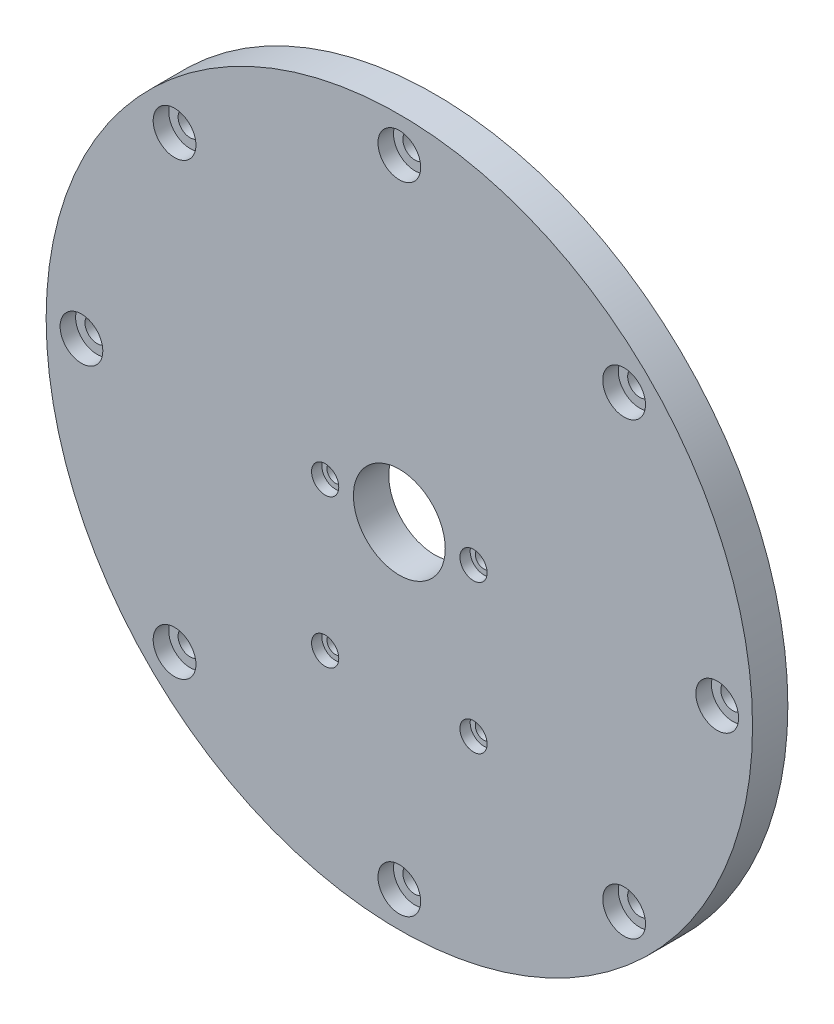
ISO-10303-21;
HEADER;
FILE_DESCRIPTION(('STEP AP214'),'2;1');
FILE_NAME('part.step','',(''),(''),'','','');
FILE_SCHEMA(('AUTOMOTIVE_DESIGN { 1 0 10303 214 1 1 1 1 }'));
ENDSEC;
DATA;
#1=APPLICATION_CONTEXT('core data for automotive mechanical design processes');
#2=APPLICATION_PROTOCOL_DEFINITION('international standard','automotive_design',2000,#1);
#3=PRODUCT_CONTEXT('',#1,'mechanical');
#4=PRODUCT('Part','Part','',(#3));
#5=PRODUCT_RELATED_PRODUCT_CATEGORY('part','',(#4));
#6=PRODUCT_DEFINITION_FORMATION('','',#4);
#7=PRODUCT_DEFINITION_CONTEXT('part definition',#1,'design');
#8=PRODUCT_DEFINITION('design','',#6,#7);
#9=PRODUCT_DEFINITION_SHAPE('','',#8);
#10=(LENGTH_UNIT() NAMED_UNIT(*) SI_UNIT(.MILLI.,.METRE.));
#11=(NAMED_UNIT(*) PLANE_ANGLE_UNIT() SI_UNIT($,.RADIAN.));
#12=(NAMED_UNIT(*) SI_UNIT($,.STERADIAN.) SOLID_ANGLE_UNIT());
#13=UNCERTAINTY_MEASURE_WITH_UNIT(LENGTH_MEASURE(1.E-05),#10,'distance_accuracy_value','');
#14=(GEOMETRIC_REPRESENTATION_CONTEXT(3) GLOBAL_UNCERTAINTY_ASSIGNED_CONTEXT((#13)) GLOBAL_UNIT_ASSIGNED_CONTEXT((#10,
#11,#12)) REPRESENTATION_CONTEXT('',''));
#15=CARTESIAN_POINT('',(0.,0.,0.));
#16=DIRECTION('',(0.,0.,1.));
#17=DIRECTION('',(1.,0.,0.));
#18=AXIS2_PLACEMENT_3D('',#15,#16,#17);
#19=CARTESIAN_POINT('',(0.,0.,5.));
#20=DIRECTION('',(0.,0.,-1.));
#21=DIRECTION('',(-1.,0.,0.));
#22=AXIS2_PLACEMENT_3D('',#19,#20,#21);
#23=CYLINDRICAL_SURFACE('',#22,50.);
#24=CARTESIAN_POINT('',(0.,0.,5.));
#25=DIRECTION('',(0.,0.,1.));
#26=DIRECTION('',(1.,0.,0.));
#27=AXIS2_PLACEMENT_3D('',#24,#25,#26);
#28=CIRCLE('',#27,50.);
#29=CARTESIAN_POINT('',(50.,0.,5.));
#30=VERTEX_POINT('',#29);
#31=EDGE_CURVE('E10',#30,#30,#28,.T.);
#32=ORIENTED_EDGE('',*,*,#31,.F.);
#33=EDGE_LOOP('',(#32));
#34=FACE_BOUND('',#33,.T.);
#35=CARTESIAN_POINT('',(0.,0.,0.));
#36=DIRECTION('',(0.,0.,1.));
#37=DIRECTION('',(1.,0.,0.));
#38=AXIS2_PLACEMENT_3D('',#35,#36,#37);
#39=CIRCLE('',#38,50.);
#40=CARTESIAN_POINT('',(50.,0.,0.));
#41=VERTEX_POINT('',#40);
#42=EDGE_CURVE('E39',#41,#41,#39,.T.);
#43=ORIENTED_EDGE('',*,*,#42,.T.);
#44=EDGE_LOOP('',(#43));
#45=FACE_BOUND('',#44,.T.);
#46=ADVANCED_FACE('F36',(#34,#45),#23,.T.);
#47=CARTESIAN_POINT('',(0.,0.,5.));
#48=DIRECTION('',(0.,0.,1.));
#49=DIRECTION('',(1.,0.,0.));
#50=AXIS2_PLACEMENT_3D('',#47,#48,#49);
#51=PLANE('',#50);
#52=CARTESIAN_POINT('',(0.,0.,5.));
#53=DIRECTION('',(0.,0.,1.));
#54=DIRECTION('',(1.,0.,0.));
#55=AXIS2_PLACEMENT_3D('',#52,#53,#54);
#56=CIRCLE('',#55,6.5);
#57=CARTESIAN_POINT('',(6.5,0.,5.));
#58=VERTEX_POINT('',#57);
#59=EDGE_CURVE('E192',#58,#58,#56,.T.);
#60=ORIENTED_EDGE('',*,*,#59,.F.);
#61=EDGE_LOOP('',(#60));
#62=FACE_BOUND('',#61,.T.);
#63=CARTESIAN_POINT('',(31.819805153395,-31.8198051533942,5.));
#64=DIRECTION('',(0.,0.,1.));
#65=DIRECTION('',(1.,0.,0.));
#66=AXIS2_PLACEMENT_3D('',#63,#64,#65);
#67=CIRCLE('',#66,3.025);
#68=CARTESIAN_POINT('',(34.844805153395,-31.8198051533942,5.));
#69=VERTEX_POINT('',#68);
#70=EDGE_CURVE('E188',#69,#69,#67,.T.);
#71=ORIENTED_EDGE('',*,*,#70,.F.);
#72=EDGE_LOOP('',(#71));
#73=FACE_BOUND('',#72,.T.);
#74=CARTESIAN_POINT('',(4.71349980743823E-13,-45.,5.));
#75=DIRECTION('',(0.,0.,1.));
#76=DIRECTION('',(1.,0.,0.));
#77=AXIS2_PLACEMENT_3D('',#74,#75,#76);
#78=CIRCLE('',#77,3.025);
#79=CARTESIAN_POINT('',(3.02500000000047,-45.,5.));
#80=VERTEX_POINT('',#79);
#81=EDGE_CURVE('E176',#80,#80,#78,.T.);
#82=ORIENTED_EDGE('',*,*,#81,.F.);
#83=EDGE_LOOP('',(#82));
#84=FACE_BOUND('',#83,.T.);
#85=CARTESIAN_POINT('',(-31.8198051533944,-31.8198051533949,5.));
#86=DIRECTION('',(0.,0.,1.));
#87=DIRECTION('',(1.,0.,0.));
#88=AXIS2_PLACEMENT_3D('',#85,#86,#87);
#89=CIRCLE('',#88,3.025);
#90=CARTESIAN_POINT('',(-28.7948051533944,-31.8198051533949,5.));
#91=VERTEX_POINT('',#90);
#92=EDGE_CURVE('E164',#91,#91,#89,.T.);
#93=ORIENTED_EDGE('',*,*,#92,.F.);
#94=EDGE_LOOP('',(#93));
#95=FACE_BOUND('',#94,.T.);
#96=CARTESIAN_POINT('',(-45.,0.,5.));
#97=DIRECTION('',(0.,0.,1.));
#98=DIRECTION('',(1.,0.,0.));
#99=AXIS2_PLACEMENT_3D('',#96,#97,#98);
#100=CIRCLE('',#99,3.025);
#101=CARTESIAN_POINT('',(-41.975,0.,5.));
#102=VERTEX_POINT('',#101);
#103=EDGE_CURVE('E152',#102,#102,#100,.T.);
#104=ORIENTED_EDGE('',*,*,#103,.F.);
#105=EDGE_LOOP('',(#104));
#106=FACE_BOUND('',#105,.T.);
#107=CARTESIAN_POINT('',(-31.8198051533948,31.8198051533945,5.));
#108=DIRECTION('',(0.,0.,1.));
#109=DIRECTION('',(1.,0.,0.));
#110=AXIS2_PLACEMENT_3D('',#107,#108,#109);
#111=CIRCLE('',#110,3.025);
#112=CARTESIAN_POINT('',(-28.7948051533948,31.8198051533945,5.));
#113=VERTEX_POINT('',#112);
#114=EDGE_CURVE('E140',#113,#113,#111,.T.);
#115=ORIENTED_EDGE('',*,*,#114,.F.);
#116=EDGE_LOOP('',(#115));
#117=FACE_BOUND('',#116,.T.);
#118=CARTESIAN_POINT('',(-1.57116660247941E-13,45.,5.));
#119=DIRECTION('',(0.,0.,1.));
#120=DIRECTION('',(1.,0.,0.));
#121=AXIS2_PLACEMENT_3D('',#118,#119,#120);
#122=CIRCLE('',#121,3.025);
#123=CARTESIAN_POINT('',(3.02499999999984,45.,5.));
#124=VERTEX_POINT('',#123);
#125=EDGE_CURVE('E128',#124,#124,#122,.T.);
#126=ORIENTED_EDGE('',*,*,#125,.F.);
#127=EDGE_LOOP('',(#126));
#128=FACE_BOUND('',#127,.T.);
#129=CARTESIAN_POINT('',(31.8198051533946,31.8198051533947,5.));
#130=DIRECTION('',(0.,0.,1.));
#131=DIRECTION('',(1.,0.,0.));
#132=AXIS2_PLACEMENT_3D('',#129,#130,#131);
#133=CIRCLE('',#132,3.025);
#134=CARTESIAN_POINT('',(34.8448051533946,31.8198051533947,5.));
#135=VERTEX_POINT('',#134);
#136=EDGE_CURVE('E116',#135,#135,#133,.T.);
#137=ORIENTED_EDGE('',*,*,#136,.F.);
#138=EDGE_LOOP('',(#137));
#139=FACE_BOUND('',#138,.T.);
#140=CARTESIAN_POINT('',(45.,0.,5.));
#141=DIRECTION('',(0.,0.,1.));
#142=DIRECTION('',(1.,0.,0.));
#143=AXIS2_PLACEMENT_3D('',#140,#141,#142);
#144=CIRCLE('',#143,3.025);
#145=CARTESIAN_POINT('',(48.025,0.,5.));
#146=VERTEX_POINT('',#145);
#147=EDGE_CURVE('E104',#146,#146,#144,.T.);
#148=ORIENTED_EDGE('',*,*,#147,.F.);
#149=EDGE_LOOP('',(#148));
#150=FACE_BOUND('',#149,.T.);
#151=CARTESIAN_POINT('',(10.5,0.,5.));
#152=DIRECTION('',(0.,0.,1.));
#153=DIRECTION('',(1.,0.,0.));
#154=AXIS2_PLACEMENT_3D('',#151,#152,#153);
#155=CIRCLE('',#154,1.925);
#156=CARTESIAN_POINT('',(12.425,0.,5.));
#157=VERTEX_POINT('',#156);
#158=EDGE_CURVE('E92',#157,#157,#155,.T.);
#159=ORIENTED_EDGE('',*,*,#158,.F.);
#160=EDGE_LOOP('',(#159));
#161=FACE_BOUND('',#160,.T.);
#162=CARTESIAN_POINT('',(10.5,-21.,5.));
#163=DIRECTION('',(0.,0.,1.));
#164=DIRECTION('',(1.,0.,0.));
#165=AXIS2_PLACEMENT_3D('',#162,#163,#164);
#166=CIRCLE('',#165,1.925);
#167=CARTESIAN_POINT('',(12.425,-21.,5.));
#168=VERTEX_POINT('',#167);
#169=EDGE_CURVE('E80',#168,#168,#166,.T.);
#170=ORIENTED_EDGE('',*,*,#169,.F.);
#171=EDGE_LOOP('',(#170));
#172=FACE_BOUND('',#171,.T.);
#173=CARTESIAN_POINT('',(-10.5,0.,5.));
#174=DIRECTION('',(0.,0.,1.));
#175=DIRECTION('',(1.,0.,0.));
#176=AXIS2_PLACEMENT_3D('',#173,#174,#175);
#177=CIRCLE('',#176,1.925);
#178=CARTESIAN_POINT('',(-8.575,0.,5.));
#179=VERTEX_POINT('',#178);
#180=EDGE_CURVE('E68',#179,#179,#177,.T.);
#181=ORIENTED_EDGE('',*,*,#180,.F.);
#182=EDGE_LOOP('',(#181));
#183=FACE_BOUND('',#182,.T.);
#184=CARTESIAN_POINT('',(-10.5,-21.,5.));
#185=DIRECTION('',(0.,0.,1.));
#186=DIRECTION('',(1.,0.,0.));
#187=AXIS2_PLACEMENT_3D('',#184,#185,#186);
#188=CIRCLE('',#187,1.925);
#189=CARTESIAN_POINT('',(-8.575,-21.,5.));
#190=VERTEX_POINT('',#189);
#191=EDGE_CURVE('E56',#190,#190,#188,.T.);
#192=ORIENTED_EDGE('',*,*,#191,.F.);
#193=EDGE_LOOP('',(#192));
#194=FACE_BOUND('',#193,.T.);
#195=ORIENTED_EDGE('',*,*,#31,.T.);
#196=EDGE_LOOP('',(#195));
#197=FACE_BOUND('',#196,.T.);
#198=ADVANCED_FACE('F208',(#62,#73,#84,#95,#106,#117,#128,#139,#150,#161,#172,#183,#194,#197),
#51,.T.);
#199=CARTESIAN_POINT('',(0.,0.,0.));
#200=DIRECTION('',(0.,0.,1.));
#201=DIRECTION('',(1.,0.,0.));
#202=AXIS2_PLACEMENT_3D('',#199,#200,#201);
#203=PLANE('',#202);
#204=CARTESIAN_POINT('',(0.,0.,0.));
#205=DIRECTION('',(0.,0.,1.));
#206=DIRECTION('',(1.,0.,0.));
#207=AXIS2_PLACEMENT_3D('',#204,#205,#206);
#208=CIRCLE('',#207,6.5);
#209=CARTESIAN_POINT('',(6.5,0.,0.));
#210=VERTEX_POINT('',#209);
#211=EDGE_CURVE('E191',#210,#210,#208,.T.);
#212=ORIENTED_EDGE('',*,*,#211,.T.);
#213=EDGE_LOOP('',(#212));
#214=FACE_BOUND('',#213,.T.);
#215=CARTESIAN_POINT('',(31.819805153395,-31.8198051533942,0.));
#216=DIRECTION('',(0.,0.,1.));
#217=DIRECTION('',(1.,0.,0.));
#218=AXIS2_PLACEMENT_3D('',#215,#216,#217);
#219=CIRCLE('',#218,1.7);
#220=CARTESIAN_POINT('',(33.519805153395,-31.8198051533942,0.));
#221=VERTEX_POINT('',#220);
#222=EDGE_CURVE('E179',#221,#221,#219,.T.);
#223=ORIENTED_EDGE('',*,*,#222,.T.);
#224=EDGE_LOOP('',(#223));
#225=FACE_BOUND('',#224,.T.);
#226=CARTESIAN_POINT('',(4.71349980743823E-13,-45.,0.));
#227=DIRECTION('',(0.,0.,1.));
#228=DIRECTION('',(1.,0.,0.));
#229=AXIS2_PLACEMENT_3D('',#226,#227,#228);
#230=CIRCLE('',#229,1.7);
#231=CARTESIAN_POINT('',(1.70000000000047,-45.,0.));
#232=VERTEX_POINT('',#231);
#233=EDGE_CURVE('E167',#232,#232,#230,.T.);
#234=ORIENTED_EDGE('',*,*,#233,.T.);
#235=EDGE_LOOP('',(#234));
#236=FACE_BOUND('',#235,.T.);
#237=CARTESIAN_POINT('',(-31.8198051533944,-31.8198051533949,0.));
#238=DIRECTION('',(0.,0.,1.));
#239=DIRECTION('',(1.,0.,0.));
#240=AXIS2_PLACEMENT_3D('',#237,#238,#239);
#241=CIRCLE('',#240,1.7);
#242=CARTESIAN_POINT('',(-30.1198051533944,-31.8198051533949,0.));
#243=VERTEX_POINT('',#242);
#244=EDGE_CURVE('E155',#243,#243,#241,.T.);
#245=ORIENTED_EDGE('',*,*,#244,.T.);
#246=EDGE_LOOP('',(#245));
#247=FACE_BOUND('',#246,.T.);
#248=CARTESIAN_POINT('',(-45.,0.,0.));
#249=DIRECTION('',(0.,0.,1.));
#250=DIRECTION('',(1.,0.,0.));
#251=AXIS2_PLACEMENT_3D('',#248,#249,#250);
#252=CIRCLE('',#251,1.7);
#253=CARTESIAN_POINT('',(-43.3,0.,0.));
#254=VERTEX_POINT('',#253);
#255=EDGE_CURVE('E143',#254,#254,#252,.T.);
#256=ORIENTED_EDGE('',*,*,#255,.T.);
#257=EDGE_LOOP('',(#256));
#258=FACE_BOUND('',#257,.T.);
#259=CARTESIAN_POINT('',(-31.8198051533948,31.8198051533945,0.));
#260=DIRECTION('',(0.,0.,1.));
#261=DIRECTION('',(1.,0.,0.));
#262=AXIS2_PLACEMENT_3D('',#259,#260,#261);
#263=CIRCLE('',#262,1.7);
#264=CARTESIAN_POINT('',(-30.1198051533948,31.8198051533945,0.));
#265=VERTEX_POINT('',#264);
#266=EDGE_CURVE('E131',#265,#265,#263,.T.);
#267=ORIENTED_EDGE('',*,*,#266,.T.);
#268=EDGE_LOOP('',(#267));
#269=FACE_BOUND('',#268,.T.);
#270=CARTESIAN_POINT('',(-1.57116660247941E-13,45.,0.));
#271=DIRECTION('',(0.,0.,1.));
#272=DIRECTION('',(1.,0.,0.));
#273=AXIS2_PLACEMENT_3D('',#270,#271,#272);
#274=CIRCLE('',#273,1.7);
#275=CARTESIAN_POINT('',(1.69999999999984,45.,0.));
#276=VERTEX_POINT('',#275);
#277=EDGE_CURVE('E119',#276,#276,#274,.T.);
#278=ORIENTED_EDGE('',*,*,#277,.T.);
#279=EDGE_LOOP('',(#278));
#280=FACE_BOUND('',#279,.T.);
#281=CARTESIAN_POINT('',(31.8198051533946,31.8198051533947,0.));
#282=DIRECTION('',(0.,0.,1.));
#283=DIRECTION('',(1.,0.,0.));
#284=AXIS2_PLACEMENT_3D('',#281,#282,#283);
#285=CIRCLE('',#284,1.7);
#286=CARTESIAN_POINT('',(33.5198051533946,31.8198051533947,0.));
#287=VERTEX_POINT('',#286);
#288=EDGE_CURVE('E107',#287,#287,#285,.T.);
#289=ORIENTED_EDGE('',*,*,#288,.T.);
#290=EDGE_LOOP('',(#289));
#291=FACE_BOUND('',#290,.T.);
#292=CARTESIAN_POINT('',(45.,0.,0.));
#293=DIRECTION('',(0.,0.,1.));
#294=DIRECTION('',(1.,0.,0.));
#295=AXIS2_PLACEMENT_3D('',#292,#293,#294);
#296=CIRCLE('',#295,1.7);
#297=CARTESIAN_POINT('',(46.7,0.,0.));
#298=VERTEX_POINT('',#297);
#299=EDGE_CURVE('E95',#298,#298,#296,.T.);
#300=ORIENTED_EDGE('',*,*,#299,.T.);
#301=EDGE_LOOP('',(#300));
#302=FACE_BOUND('',#301,.T.);
#303=CARTESIAN_POINT('',(10.5,0.,0.));
#304=DIRECTION('',(0.,0.,1.));
#305=DIRECTION('',(1.,0.,0.));
#306=AXIS2_PLACEMENT_3D('',#303,#304,#305);
#307=CIRCLE('',#306,1.2);
#308=CARTESIAN_POINT('',(11.7,0.,0.));
#309=VERTEX_POINT('',#308);
#310=EDGE_CURVE('E83',#309,#309,#307,.T.);
#311=ORIENTED_EDGE('',*,*,#310,.T.);
#312=EDGE_LOOP('',(#311));
#313=FACE_BOUND('',#312,.T.);
#314=CARTESIAN_POINT('',(10.5,-21.,0.));
#315=DIRECTION('',(0.,0.,1.));
#316=DIRECTION('',(1.,0.,0.));
#317=AXIS2_PLACEMENT_3D('',#314,#315,#316);
#318=CIRCLE('',#317,1.2);
#319=CARTESIAN_POINT('',(11.7,-21.,0.));
#320=VERTEX_POINT('',#319);
#321=EDGE_CURVE('E71',#320,#320,#318,.T.);
#322=ORIENTED_EDGE('',*,*,#321,.T.);
#323=EDGE_LOOP('',(#322));
#324=FACE_BOUND('',#323,.T.);
#325=CARTESIAN_POINT('',(-10.5,0.,0.));
#326=DIRECTION('',(0.,0.,1.));
#327=DIRECTION('',(1.,0.,0.));
#328=AXIS2_PLACEMENT_3D('',#325,#326,#327);
#329=CIRCLE('',#328,1.2);
#330=CARTESIAN_POINT('',(-9.3,0.,0.));
#331=VERTEX_POINT('',#330);
#332=EDGE_CURVE('E59',#331,#331,#329,.T.);
#333=ORIENTED_EDGE('',*,*,#332,.T.);
#334=EDGE_LOOP('',(#333));
#335=FACE_BOUND('',#334,.T.);
#336=CARTESIAN_POINT('',(-10.5,-21.,0.));
#337=DIRECTION('',(0.,0.,1.));
#338=DIRECTION('',(1.,0.,0.));
#339=AXIS2_PLACEMENT_3D('',#336,#337,#338);
#340=CIRCLE('',#339,1.2);
#341=CARTESIAN_POINT('',(-9.3,-21.,0.));
#342=VERTEX_POINT('',#341);
#343=EDGE_CURVE('E46',#342,#342,#340,.T.);
#344=ORIENTED_EDGE('',*,*,#343,.T.);
#345=EDGE_LOOP('',(#344));
#346=FACE_BOUND('',#345,.T.);
#347=ORIENTED_EDGE('',*,*,#42,.F.);
#348=EDGE_LOOP('',(#347));
#349=FACE_BOUND('',#348,.T.);
#350=ADVANCED_FACE('F198',(#214,#225,#236,#247,#258,#269,#280,#291,#302,#313,#324,#335,#346,
#349),#203,.F.);
#351=CARTESIAN_POINT('',(-10.5,-21.,5.));
#352=DIRECTION('',(0.,0.,1.));
#353=DIRECTION('',(1.,0.,0.));
#354=AXIS2_PLACEMENT_3D('',#351,#352,#353);
#355=CYLINDRICAL_SURFACE('',#354,1.2);
#356=ORIENTED_EDGE('',*,*,#343,.F.);
#357=EDGE_LOOP('',(#356));
#358=FACE_BOUND('',#357,.T.);
#359=CARTESIAN_POINT('',(-10.5,-21.,3.55));
#360=DIRECTION('',(0.,0.,1.));
#361=DIRECTION('',(1.,0.,0.));
#362=AXIS2_PLACEMENT_3D('',#359,#360,#361);
#363=CIRCLE('',#362,1.2);
#364=CARTESIAN_POINT('',(-9.3,-21.,3.55));
#365=VERTEX_POINT('',#364);
#366=EDGE_CURVE('E50',#365,#365,#363,.T.);
#367=ORIENTED_EDGE('',*,*,#366,.T.);
#368=EDGE_LOOP('',(#367));
#369=FACE_BOUND('',#368,.T.);
#370=ADVANCED_FACE('F249',(#358,#369),#355,.F.);
#371=CARTESIAN_POINT('',(-9.3,-21.,3.55));
#372=DIRECTION('',(0.,0.,-1.));
#373=DIRECTION('',(-1.,0.,0.));
#374=AXIS2_PLACEMENT_3D('',#371,#372,#373);
#375=PLANE('',#374);
#376=ORIENTED_EDGE('',*,*,#366,.F.);
#377=EDGE_LOOP('',(#376));
#378=FACE_BOUND('',#377,.T.);
#379=CARTESIAN_POINT('',(-10.5,-21.,3.55));
#380=DIRECTION('',(0.,0.,1.));
#381=DIRECTION('',(1.,0.,0.));
#382=AXIS2_PLACEMENT_3D('',#379,#380,#381);
#383=CIRCLE('',#382,1.925);
#384=CARTESIAN_POINT('',(-8.575,-21.,3.55));
#385=VERTEX_POINT('',#384);
#386=EDGE_CURVE('E53',#385,#385,#383,.T.);
#387=ORIENTED_EDGE('',*,*,#386,.T.);
#388=EDGE_LOOP('',(#387));
#389=FACE_BOUND('',#388,.T.);
#390=ADVANCED_FACE('F239',(#378,#389),#375,.F.);
#391=CARTESIAN_POINT('',(-10.5,-21.,5.));
#392=DIRECTION('',(0.,0.,1.));
#393=DIRECTION('',(1.,0.,0.));
#394=AXIS2_PLACEMENT_3D('',#391,#392,#393);
#395=CYLINDRICAL_SURFACE('',#394,1.925);
#396=ORIENTED_EDGE('',*,*,#386,.F.);
#397=EDGE_LOOP('',(#396));
#398=FACE_BOUND('',#397,.T.);
#399=ORIENTED_EDGE('',*,*,#191,.T.);
#400=EDGE_LOOP('',(#399));
#401=FACE_BOUND('',#400,.T.);
#402=ADVANCED_FACE('F236',(#398,#401),#395,.F.);
#403=CARTESIAN_POINT('',(-10.5,0.,5.));
#404=DIRECTION('',(0.,0.,1.));
#405=DIRECTION('',(1.,0.,0.));
#406=AXIS2_PLACEMENT_3D('',#403,#404,#405);
#407=CYLINDRICAL_SURFACE('',#406,1.2);
#408=ORIENTED_EDGE('',*,*,#332,.F.);
#409=EDGE_LOOP('',(#408));
#410=FACE_BOUND('',#409,.T.);
#411=CARTESIAN_POINT('',(-10.5,0.,3.55));
#412=DIRECTION('',(0.,0.,1.));
#413=DIRECTION('',(1.,0.,0.));
#414=AXIS2_PLACEMENT_3D('',#411,#412,#413);
#415=CIRCLE('',#414,1.2);
#416=CARTESIAN_POINT('',(-9.3,0.,3.55));
#417=VERTEX_POINT('',#416);
#418=EDGE_CURVE('E62',#417,#417,#415,.T.);
#419=ORIENTED_EDGE('',*,*,#418,.T.);
#420=EDGE_LOOP('',(#419));
#421=FACE_BOUND('',#420,.T.);
#422=ADVANCED_FACE('F238',(#410,#421),#407,.F.);
#423=CARTESIAN_POINT('',(-9.3,0.,3.55));
#424=DIRECTION('',(0.,0.,-1.));
#425=DIRECTION('',(-1.,0.,0.));
#426=AXIS2_PLACEMENT_3D('',#423,#424,#425);
#427=PLANE('',#426);
#428=ORIENTED_EDGE('',*,*,#418,.F.);
#429=EDGE_LOOP('',(#428));
#430=FACE_BOUND('',#429,.T.);
#431=CARTESIAN_POINT('',(-10.5,0.,3.55));
#432=DIRECTION('',(0.,0.,1.));
#433=DIRECTION('',(1.,0.,0.));
#434=AXIS2_PLACEMENT_3D('',#431,#432,#433);
#435=CIRCLE('',#434,1.925);
#436=CARTESIAN_POINT('',(-8.575,0.,3.55));
#437=VERTEX_POINT('',#436);
#438=EDGE_CURVE('E65',#437,#437,#435,.T.);
#439=ORIENTED_EDGE('',*,*,#438,.T.);
#440=EDGE_LOOP('',(#439));
#441=FACE_BOUND('',#440,.T.);
#442=ADVANCED_FACE('F246',(#430,#441),#427,.F.);
#443=CARTESIAN_POINT('',(-10.5,0.,5.));
#444=DIRECTION('',(0.,0.,1.));
#445=DIRECTION('',(1.,0.,0.));
#446=AXIS2_PLACEMENT_3D('',#443,#444,#445);
#447=CYLINDRICAL_SURFACE('',#446,1.925);
#448=ORIENTED_EDGE('',*,*,#438,.F.);
#449=EDGE_LOOP('',(#448));
#450=FACE_BOUND('',#449,.T.);
#451=ORIENTED_EDGE('',*,*,#180,.T.);
#452=EDGE_LOOP('',(#451));
#453=FACE_BOUND('',#452,.T.);
#454=ADVANCED_FACE('F298',(#450,#453),#447,.F.);
#455=CARTESIAN_POINT('',(10.5,-21.,5.));
#456=DIRECTION('',(0.,0.,1.));
#457=DIRECTION('',(1.,0.,0.));
#458=AXIS2_PLACEMENT_3D('',#455,#456,#457);
#459=CYLINDRICAL_SURFACE('',#458,1.2);
#460=ORIENTED_EDGE('',*,*,#321,.F.);
#461=EDGE_LOOP('',(#460));
#462=FACE_BOUND('',#461,.T.);
#463=CARTESIAN_POINT('',(10.5,-21.,3.55));
#464=DIRECTION('',(0.,0.,1.));
#465=DIRECTION('',(1.,0.,0.));
#466=AXIS2_PLACEMENT_3D('',#463,#464,#465);
#467=CIRCLE('',#466,1.2);
#468=CARTESIAN_POINT('',(11.7,-21.,3.55));
#469=VERTEX_POINT('',#468);
#470=EDGE_CURVE('E74',#469,#469,#467,.T.);
#471=ORIENTED_EDGE('',*,*,#470,.T.);
#472=EDGE_LOOP('',(#471));
#473=FACE_BOUND('',#472,.T.);
#474=ADVANCED_FACE('F308',(#462,#473),#459,.F.);
#475=CARTESIAN_POINT('',(11.7,-21.,3.55));
#476=DIRECTION('',(0.,0.,-1.));
#477=DIRECTION('',(-1.,0.,0.));
#478=AXIS2_PLACEMENT_3D('',#475,#476,#477);
#479=PLANE('',#478);
#480=ORIENTED_EDGE('',*,*,#470,.F.);
#481=EDGE_LOOP('',(#480));
#482=FACE_BOUND('',#481,.T.);
#483=CARTESIAN_POINT('',(10.5,-21.,3.55));
#484=DIRECTION('',(0.,0.,1.));
#485=DIRECTION('',(1.,0.,0.));
#486=AXIS2_PLACEMENT_3D('',#483,#484,#485);
#487=CIRCLE('',#486,1.925);
#488=CARTESIAN_POINT('',(12.425,-21.,3.55));
#489=VERTEX_POINT('',#488);
#490=EDGE_CURVE('E77',#489,#489,#487,.T.);
#491=ORIENTED_EDGE('',*,*,#490,.T.);
#492=EDGE_LOOP('',(#491));
#493=FACE_BOUND('',#492,.T.);
#494=ADVANCED_FACE('F318',(#482,#493),#479,.F.);
#495=CARTESIAN_POINT('',(10.5,-21.,5.));
#496=DIRECTION('',(0.,0.,1.));
#497=DIRECTION('',(1.,0.,0.));
#498=AXIS2_PLACEMENT_3D('',#495,#496,#497);
#499=CYLINDRICAL_SURFACE('',#498,1.925);
#500=ORIENTED_EDGE('',*,*,#490,.F.);
#501=EDGE_LOOP('',(#500));
#502=FACE_BOUND('',#501,.T.);
#503=ORIENTED_EDGE('',*,*,#169,.T.);
#504=EDGE_LOOP('',(#503));
#505=FACE_BOUND('',#504,.T.);
#506=ADVANCED_FACE('F328',(#502,#505),#499,.F.);
#507=CARTESIAN_POINT('',(10.5,0.,5.));
#508=DIRECTION('',(0.,0.,1.));
#509=DIRECTION('',(1.,0.,0.));
#510=AXIS2_PLACEMENT_3D('',#507,#508,#509);
#511=CYLINDRICAL_SURFACE('',#510,1.2);
#512=ORIENTED_EDGE('',*,*,#310,.F.);
#513=EDGE_LOOP('',(#512));
#514=FACE_BOUND('',#513,.T.);
#515=CARTESIAN_POINT('',(10.5,0.,3.55));
#516=DIRECTION('',(0.,0.,1.));
#517=DIRECTION('',(1.,0.,0.));
#518=AXIS2_PLACEMENT_3D('',#515,#516,#517);
#519=CIRCLE('',#518,1.2);
#520=CARTESIAN_POINT('',(11.7,0.,3.55));
#521=VERTEX_POINT('',#520);
#522=EDGE_CURVE('E86',#521,#521,#519,.T.);
#523=ORIENTED_EDGE('',*,*,#522,.T.);
#524=EDGE_LOOP('',(#523));
#525=FACE_BOUND('',#524,.T.);
#526=ADVANCED_FACE('F338',(#514,#525),#511,.F.);
#527=CARTESIAN_POINT('',(11.7,0.,3.55));
#528=DIRECTION('',(0.,0.,-1.));
#529=DIRECTION('',(-1.,0.,0.));
#530=AXIS2_PLACEMENT_3D('',#527,#528,#529);
#531=PLANE('',#530);
#532=ORIENTED_EDGE('',*,*,#522,.F.);
#533=EDGE_LOOP('',(#532));
#534=FACE_BOUND('',#533,.T.);
#535=CARTESIAN_POINT('',(10.5,0.,3.55));
#536=DIRECTION('',(0.,0.,1.));
#537=DIRECTION('',(1.,0.,0.));
#538=AXIS2_PLACEMENT_3D('',#535,#536,#537);
#539=CIRCLE('',#538,1.925);
#540=CARTESIAN_POINT('',(12.425,0.,3.55));
#541=VERTEX_POINT('',#540);
#542=EDGE_CURVE('E89',#541,#541,#539,.T.);
#543=ORIENTED_EDGE('',*,*,#542,.T.);
#544=EDGE_LOOP('',(#543));
#545=FACE_BOUND('',#544,.T.);
#546=ADVANCED_FACE('F348',(#534,#545),#531,.F.);
#547=CARTESIAN_POINT('',(10.5,0.,5.));
#548=DIRECTION('',(0.,0.,1.));
#549=DIRECTION('',(1.,0.,0.));
#550=AXIS2_PLACEMENT_3D('',#547,#548,#549);
#551=CYLINDRICAL_SURFACE('',#550,1.925);
#552=ORIENTED_EDGE('',*,*,#542,.F.);
#553=EDGE_LOOP('',(#552));
#554=FACE_BOUND('',#553,.T.);
#555=ORIENTED_EDGE('',*,*,#158,.T.);
#556=EDGE_LOOP('',(#555));
#557=FACE_BOUND('',#556,.T.);
#558=ADVANCED_FACE('F358',(#554,#557),#551,.F.);
#559=CARTESIAN_POINT('',(45.,0.,5.));
#560=DIRECTION('',(0.,0.,1.));
#561=DIRECTION('',(1.,0.,0.));
#562=AXIS2_PLACEMENT_3D('',#559,#560,#561);
#563=CYLINDRICAL_SURFACE('',#562,1.70000000000001);
#564=ORIENTED_EDGE('',*,*,#299,.F.);
#565=EDGE_LOOP('',(#564));
#566=FACE_BOUND('',#565,.T.);
#567=CARTESIAN_POINT('',(45.,0.,2.8));
#568=DIRECTION('',(0.,0.,1.));
#569=DIRECTION('',(1.,0.,0.));
#570=AXIS2_PLACEMENT_3D('',#567,#568,#569);
#571=CIRCLE('',#570,1.70000000000001);
#572=CARTESIAN_POINT('',(46.7,0.,2.8));
#573=VERTEX_POINT('',#572);
#574=EDGE_CURVE('E98',#573,#573,#571,.T.);
#575=ORIENTED_EDGE('',*,*,#574,.T.);
#576=EDGE_LOOP('',(#575));
#577=FACE_BOUND('',#576,.T.);
#578=ADVANCED_FACE('F368',(#566,#577),#563,.F.);
#579=CARTESIAN_POINT('',(46.7,0.,2.8));
#580=DIRECTION('',(0.,0.,-1.));
#581=DIRECTION('',(-1.,0.,0.));
#582=AXIS2_PLACEMENT_3D('',#579,#580,#581);
#583=PLANE('',#582);
#584=ORIENTED_EDGE('',*,*,#574,.F.);
#585=EDGE_LOOP('',(#584));
#586=FACE_BOUND('',#585,.T.);
#587=CARTESIAN_POINT('',(45.,0.,2.8));
#588=DIRECTION('',(0.,0.,1.));
#589=DIRECTION('',(1.,0.,0.));
#590=AXIS2_PLACEMENT_3D('',#587,#588,#589);
#591=CIRCLE('',#590,3.025);
#592=CARTESIAN_POINT('',(48.025,0.,2.8));
#593=VERTEX_POINT('',#592);
#594=EDGE_CURVE('E101',#593,#593,#591,.T.);
#595=ORIENTED_EDGE('',*,*,#594,.T.);
#596=EDGE_LOOP('',(#595));
#597=FACE_BOUND('',#596,.T.);
#598=ADVANCED_FACE('F378',(#586,#597),#583,.F.);
#599=CARTESIAN_POINT('',(45.,0.,5.));
#600=DIRECTION('',(0.,0.,1.));
#601=DIRECTION('',(1.,0.,0.));
#602=AXIS2_PLACEMENT_3D('',#599,#600,#601);
#603=CYLINDRICAL_SURFACE('',#602,3.025);
#604=ORIENTED_EDGE('',*,*,#594,.F.);
#605=EDGE_LOOP('',(#604));
#606=FACE_BOUND('',#605,.T.);
#607=ORIENTED_EDGE('',*,*,#147,.T.);
#608=EDGE_LOOP('',(#607));
#609=FACE_BOUND('',#608,.T.);
#610=ADVANCED_FACE('F388',(#606,#609),#603,.F.);
#611=CARTESIAN_POINT('',(31.8198051533946,31.8198051533947,5.));
#612=DIRECTION('',(0.,0.,1.));
#613=DIRECTION('',(1.,0.,0.));
#614=AXIS2_PLACEMENT_3D('',#611,#612,#613);
#615=CYLINDRICAL_SURFACE('',#614,1.70000000000001);
#616=ORIENTED_EDGE('',*,*,#288,.F.);
#617=EDGE_LOOP('',(#616));
#618=FACE_BOUND('',#617,.T.);
#619=CARTESIAN_POINT('',(31.8198051533946,31.8198051533947,2.8));
#620=DIRECTION('',(0.,0.,1.));
#621=DIRECTION('',(1.,0.,0.));
#622=AXIS2_PLACEMENT_3D('',#619,#620,#621);
#623=CIRCLE('',#622,1.70000000000001);
#624=CARTESIAN_POINT('',(33.5198051533946,31.8198051533947,2.8));
#625=VERTEX_POINT('',#624);
#626=EDGE_CURVE('E110',#625,#625,#623,.T.);
#627=ORIENTED_EDGE('',*,*,#626,.T.);
#628=EDGE_LOOP('',(#627));
#629=FACE_BOUND('',#628,.T.);
#630=ADVANCED_FACE('F398',(#618,#629),#615,.F.);
#631=CARTESIAN_POINT('',(33.5198051533946,31.8198051533947,2.8));
#632=DIRECTION('',(0.,0.,-1.));
#633=DIRECTION('',(-1.,0.,0.));
#634=AXIS2_PLACEMENT_3D('',#631,#632,#633);
#635=PLANE('',#634);
#636=ORIENTED_EDGE('',*,*,#626,.F.);
#637=EDGE_LOOP('',(#636));
#638=FACE_BOUND('',#637,.T.);
#639=CARTESIAN_POINT('',(31.8198051533946,31.8198051533947,2.8));
#640=DIRECTION('',(0.,0.,1.));
#641=DIRECTION('',(1.,0.,0.));
#642=AXIS2_PLACEMENT_3D('',#639,#640,#641);
#643=CIRCLE('',#642,3.025);
#644=CARTESIAN_POINT('',(34.8448051533946,31.8198051533947,2.8));
#645=VERTEX_POINT('',#644);
#646=EDGE_CURVE('E113',#645,#645,#643,.T.);
#647=ORIENTED_EDGE('',*,*,#646,.T.);
#648=EDGE_LOOP('',(#647));
#649=FACE_BOUND('',#648,.T.);
#650=ADVANCED_FACE('F408',(#638,#649),#635,.F.);
#651=CARTESIAN_POINT('',(31.8198051533946,31.8198051533947,5.));
#652=DIRECTION('',(0.,0.,1.));
#653=DIRECTION('',(1.,0.,0.));
#654=AXIS2_PLACEMENT_3D('',#651,#652,#653);
#655=CYLINDRICAL_SURFACE('',#654,3.025);
#656=ORIENTED_EDGE('',*,*,#646,.F.);
#657=EDGE_LOOP('',(#656));
#658=FACE_BOUND('',#657,.T.);
#659=ORIENTED_EDGE('',*,*,#136,.T.);
#660=EDGE_LOOP('',(#659));
#661=FACE_BOUND('',#660,.T.);
#662=ADVANCED_FACE('F418',(#658,#661),#655,.F.);
#663=CARTESIAN_POINT('',(-1.57116660247941E-13,45.,5.));
#664=DIRECTION('',(0.,0.,1.));
#665=DIRECTION('',(1.,0.,0.));
#666=AXIS2_PLACEMENT_3D('',#663,#664,#665);
#667=CYLINDRICAL_SURFACE('',#666,1.70000000000001);
#668=ORIENTED_EDGE('',*,*,#277,.F.);
#669=EDGE_LOOP('',(#668));
#670=FACE_BOUND('',#669,.T.);
#671=CARTESIAN_POINT('',(-1.57116660247941E-13,45.,2.8));
#672=DIRECTION('',(0.,0.,1.));
#673=DIRECTION('',(1.,0.,0.));
#674=AXIS2_PLACEMENT_3D('',#671,#672,#673);
#675=CIRCLE('',#674,1.70000000000001);
#676=CARTESIAN_POINT('',(1.69999999999985,45.,2.8));
#677=VERTEX_POINT('',#676);
#678=EDGE_CURVE('E122',#677,#677,#675,.T.);
#679=ORIENTED_EDGE('',*,*,#678,.T.);
#680=EDGE_LOOP('',(#679));
#681=FACE_BOUND('',#680,.T.);
#682=ADVANCED_FACE('F428',(#670,#681),#667,.F.);
#683=CARTESIAN_POINT('',(1.69999999999985,45.,2.8));
#684=DIRECTION('',(0.,0.,-1.));
#685=DIRECTION('',(-1.,0.,0.));
#686=AXIS2_PLACEMENT_3D('',#683,#684,#685);
#687=PLANE('',#686);
#688=ORIENTED_EDGE('',*,*,#678,.F.);
#689=EDGE_LOOP('',(#688));
#690=FACE_BOUND('',#689,.T.);
#691=CARTESIAN_POINT('',(-1.57116660247941E-13,45.,2.8));
#692=DIRECTION('',(0.,0.,1.));
#693=DIRECTION('',(1.,0.,0.));
#694=AXIS2_PLACEMENT_3D('',#691,#692,#693);
#695=CIRCLE('',#694,3.025);
#696=CARTESIAN_POINT('',(3.02499999999984,45.,2.8));
#697=VERTEX_POINT('',#696);
#698=EDGE_CURVE('E125',#697,#697,#695,.T.);
#699=ORIENTED_EDGE('',*,*,#698,.T.);
#700=EDGE_LOOP('',(#699));
#701=FACE_BOUND('',#700,.T.);
#702=ADVANCED_FACE('F438',(#690,#701),#687,.F.);
#703=CARTESIAN_POINT('',(-1.57116660247941E-13,45.,5.));
#704=DIRECTION('',(0.,0.,1.));
#705=DIRECTION('',(1.,0.,0.));
#706=AXIS2_PLACEMENT_3D('',#703,#704,#705);
#707=CYLINDRICAL_SURFACE('',#706,3.025);
#708=ORIENTED_EDGE('',*,*,#698,.F.);
#709=EDGE_LOOP('',(#708));
#710=FACE_BOUND('',#709,.T.);
#711=ORIENTED_EDGE('',*,*,#125,.T.);
#712=EDGE_LOOP('',(#711));
#713=FACE_BOUND('',#712,.T.);
#714=ADVANCED_FACE('F448',(#710,#713),#707,.F.);
#715=CARTESIAN_POINT('',(-31.8198051533948,31.8198051533945,5.));
#716=DIRECTION('',(0.,0.,1.));
#717=DIRECTION('',(1.,0.,0.));
#718=AXIS2_PLACEMENT_3D('',#715,#716,#717);
#719=CYLINDRICAL_SURFACE('',#718,1.70000000000001);
#720=ORIENTED_EDGE('',*,*,#266,.F.);
#721=EDGE_LOOP('',(#720));
#722=FACE_BOUND('',#721,.T.);
#723=CARTESIAN_POINT('',(-31.8198051533948,31.8198051533945,2.8));
#724=DIRECTION('',(0.,0.,1.));
#725=DIRECTION('',(1.,0.,0.));
#726=AXIS2_PLACEMENT_3D('',#723,#724,#725);
#727=CIRCLE('',#726,1.70000000000001);
#728=CARTESIAN_POINT('',(-30.1198051533948,31.8198051533945,2.8));
#729=VERTEX_POINT('',#728);
#730=EDGE_CURVE('E134',#729,#729,#727,.T.);
#731=ORIENTED_EDGE('',*,*,#730,.T.);
#732=EDGE_LOOP('',(#731));
#733=FACE_BOUND('',#732,.T.);
#734=ADVANCED_FACE('F458',(#722,#733),#719,.F.);
#735=CARTESIAN_POINT('',(-30.1198051533948,31.8198051533945,2.8));
#736=DIRECTION('',(0.,0.,-1.));
#737=DIRECTION('',(-1.,0.,0.));
#738=AXIS2_PLACEMENT_3D('',#735,#736,#737);
#739=PLANE('',#738);
#740=ORIENTED_EDGE('',*,*,#730,.F.);
#741=EDGE_LOOP('',(#740));
#742=FACE_BOUND('',#741,.T.);
#743=CARTESIAN_POINT('',(-31.8198051533948,31.8198051533945,2.8));
#744=DIRECTION('',(0.,0.,1.));
#745=DIRECTION('',(1.,0.,0.));
#746=AXIS2_PLACEMENT_3D('',#743,#744,#745);
#747=CIRCLE('',#746,3.025);
#748=CARTESIAN_POINT('',(-28.7948051533948,31.8198051533945,2.8));
#749=VERTEX_POINT('',#748);
#750=EDGE_CURVE('E137',#749,#749,#747,.T.);
#751=ORIENTED_EDGE('',*,*,#750,.T.);
#752=EDGE_LOOP('',(#751));
#753=FACE_BOUND('',#752,.T.);
#754=ADVANCED_FACE('F468',(#742,#753),#739,.F.);
#755=CARTESIAN_POINT('',(-31.8198051533948,31.8198051533945,5.));
#756=DIRECTION('',(0.,0.,1.));
#757=DIRECTION('',(1.,0.,0.));
#758=AXIS2_PLACEMENT_3D('',#755,#756,#757);
#759=CYLINDRICAL_SURFACE('',#758,3.025);
#760=ORIENTED_EDGE('',*,*,#750,.F.);
#761=EDGE_LOOP('',(#760));
#762=FACE_BOUND('',#761,.T.);
#763=ORIENTED_EDGE('',*,*,#114,.T.);
#764=EDGE_LOOP('',(#763));
#765=FACE_BOUND('',#764,.T.);
#766=ADVANCED_FACE('F478',(#762,#765),#759,.F.);
#767=CARTESIAN_POINT('',(-45.,0.,5.));
#768=DIRECTION('',(0.,0.,1.));
#769=DIRECTION('',(1.,0.,0.));
#770=AXIS2_PLACEMENT_3D('',#767,#768,#769);
#771=CYLINDRICAL_SURFACE('',#770,1.70000000000001);
#772=ORIENTED_EDGE('',*,*,#255,.F.);
#773=EDGE_LOOP('',(#772));
#774=FACE_BOUND('',#773,.T.);
#775=CARTESIAN_POINT('',(-45.,0.,2.8));
#776=DIRECTION('',(0.,0.,1.));
#777=DIRECTION('',(1.,0.,0.));
#778=AXIS2_PLACEMENT_3D('',#775,#776,#777);
#779=CIRCLE('',#778,1.70000000000001);
#780=CARTESIAN_POINT('',(-43.3,0.,2.8));
#781=VERTEX_POINT('',#780);
#782=EDGE_CURVE('E146',#781,#781,#779,.T.);
#783=ORIENTED_EDGE('',*,*,#782,.T.);
#784=EDGE_LOOP('',(#783));
#785=FACE_BOUND('',#784,.T.);
#786=ADVANCED_FACE('F488',(#774,#785),#771,.F.);
#787=CARTESIAN_POINT('',(-43.3,0.,2.8));
#788=DIRECTION('',(0.,0.,-1.));
#789=DIRECTION('',(-1.,0.,0.));
#790=AXIS2_PLACEMENT_3D('',#787,#788,#789);
#791=PLANE('',#790);
#792=ORIENTED_EDGE('',*,*,#782,.F.);
#793=EDGE_LOOP('',(#792));
#794=FACE_BOUND('',#793,.T.);
#795=CARTESIAN_POINT('',(-45.,0.,2.8));
#796=DIRECTION('',(0.,0.,1.));
#797=DIRECTION('',(1.,0.,0.));
#798=AXIS2_PLACEMENT_3D('',#795,#796,#797);
#799=CIRCLE('',#798,3.025);
#800=CARTESIAN_POINT('',(-41.975,0.,2.8));
#801=VERTEX_POINT('',#800);
#802=EDGE_CURVE('E149',#801,#801,#799,.T.);
#803=ORIENTED_EDGE('',*,*,#802,.T.);
#804=EDGE_LOOP('',(#803));
#805=FACE_BOUND('',#804,.T.);
#806=ADVANCED_FACE('F498',(#794,#805),#791,.F.);
#807=CARTESIAN_POINT('',(-45.,0.,5.));
#808=DIRECTION('',(0.,0.,1.));
#809=DIRECTION('',(1.,0.,0.));
#810=AXIS2_PLACEMENT_3D('',#807,#808,#809);
#811=CYLINDRICAL_SURFACE('',#810,3.025);
#812=ORIENTED_EDGE('',*,*,#802,.F.);
#813=EDGE_LOOP('',(#812));
#814=FACE_BOUND('',#813,.T.);
#815=ORIENTED_EDGE('',*,*,#103,.T.);
#816=EDGE_LOOP('',(#815));
#817=FACE_BOUND('',#816,.T.);
#818=ADVANCED_FACE('F508',(#814,#817),#811,.F.);
#819=CARTESIAN_POINT('',(-31.8198051533944,-31.8198051533949,5.));
#820=DIRECTION('',(0.,0.,1.));
#821=DIRECTION('',(1.,0.,0.));
#822=AXIS2_PLACEMENT_3D('',#819,#820,#821);
#823=CYLINDRICAL_SURFACE('',#822,1.70000000000001);
#824=ORIENTED_EDGE('',*,*,#244,.F.);
#825=EDGE_LOOP('',(#824));
#826=FACE_BOUND('',#825,.T.);
#827=CARTESIAN_POINT('',(-31.8198051533944,-31.8198051533949,2.8));
#828=DIRECTION('',(0.,0.,1.));
#829=DIRECTION('',(1.,0.,0.));
#830=AXIS2_PLACEMENT_3D('',#827,#828,#829);
#831=CIRCLE('',#830,1.70000000000001);
#832=CARTESIAN_POINT('',(-30.1198051533943,-31.8198051533949,2.8));
#833=VERTEX_POINT('',#832);
#834=EDGE_CURVE('E158',#833,#833,#831,.T.);
#835=ORIENTED_EDGE('',*,*,#834,.T.);
#836=EDGE_LOOP('',(#835));
#837=FACE_BOUND('',#836,.T.);
#838=ADVANCED_FACE('F518',(#826,#837),#823,.F.);
#839=CARTESIAN_POINT('',(-30.1198051533943,-31.8198051533949,2.8));
#840=DIRECTION('',(0.,0.,-1.));
#841=DIRECTION('',(-1.,0.,0.));
#842=AXIS2_PLACEMENT_3D('',#839,#840,#841);
#843=PLANE('',#842);
#844=ORIENTED_EDGE('',*,*,#834,.F.);
#845=EDGE_LOOP('',(#844));
#846=FACE_BOUND('',#845,.T.);
#847=CARTESIAN_POINT('',(-31.8198051533944,-31.8198051533949,2.8));
#848=DIRECTION('',(0.,0.,1.));
#849=DIRECTION('',(1.,0.,0.));
#850=AXIS2_PLACEMENT_3D('',#847,#848,#849);
#851=CIRCLE('',#850,3.025);
#852=CARTESIAN_POINT('',(-28.7948051533944,-31.8198051533949,2.8));
#853=VERTEX_POINT('',#852);
#854=EDGE_CURVE('E161',#853,#853,#851,.T.);
#855=ORIENTED_EDGE('',*,*,#854,.T.);
#856=EDGE_LOOP('',(#855));
#857=FACE_BOUND('',#856,.T.);
#858=ADVANCED_FACE('F528',(#846,#857),#843,.F.);
#859=CARTESIAN_POINT('',(-31.8198051533944,-31.8198051533949,5.));
#860=DIRECTION('',(0.,0.,1.));
#861=DIRECTION('',(1.,0.,0.));
#862=AXIS2_PLACEMENT_3D('',#859,#860,#861);
#863=CYLINDRICAL_SURFACE('',#862,3.025);
#864=ORIENTED_EDGE('',*,*,#854,.F.);
#865=EDGE_LOOP('',(#864));
#866=FACE_BOUND('',#865,.T.);
#867=ORIENTED_EDGE('',*,*,#92,.T.);
#868=EDGE_LOOP('',(#867));
#869=FACE_BOUND('',#868,.T.);
#870=ADVANCED_FACE('F538',(#866,#869),#863,.F.);
#871=CARTESIAN_POINT('',(4.71349980743823E-13,-45.,5.));
#872=DIRECTION('',(0.,0.,1.));
#873=DIRECTION('',(1.,0.,0.));
#874=AXIS2_PLACEMENT_3D('',#871,#872,#873);
#875=CYLINDRICAL_SURFACE('',#874,1.70000000000001);
#876=ORIENTED_EDGE('',*,*,#233,.F.);
#877=EDGE_LOOP('',(#876));
#878=FACE_BOUND('',#877,.T.);
#879=CARTESIAN_POINT('',(4.71349980743823E-13,-45.,2.8));
#880=DIRECTION('',(0.,0.,1.));
#881=DIRECTION('',(1.,0.,0.));
#882=AXIS2_PLACEMENT_3D('',#879,#880,#881);
#883=CIRCLE('',#882,1.70000000000001);
#884=CARTESIAN_POINT('',(1.70000000000048,-45.,2.8));
#885=VERTEX_POINT('',#884);
#886=EDGE_CURVE('E170',#885,#885,#883,.T.);
#887=ORIENTED_EDGE('',*,*,#886,.T.);
#888=EDGE_LOOP('',(#887));
#889=FACE_BOUND('',#888,.T.);
#890=ADVANCED_FACE('F548',(#878,#889),#875,.F.);
#891=CARTESIAN_POINT('',(1.70000000000048,-45.,2.8));
#892=DIRECTION('',(0.,0.,-1.));
#893=DIRECTION('',(-1.,0.,0.));
#894=AXIS2_PLACEMENT_3D('',#891,#892,#893);
#895=PLANE('',#894);
#896=ORIENTED_EDGE('',*,*,#886,.F.);
#897=EDGE_LOOP('',(#896));
#898=FACE_BOUND('',#897,.T.);
#899=CARTESIAN_POINT('',(4.71349980743823E-13,-45.,2.8));
#900=DIRECTION('',(0.,0.,1.));
#901=DIRECTION('',(1.,0.,0.));
#902=AXIS2_PLACEMENT_3D('',#899,#900,#901);
#903=CIRCLE('',#902,3.025);
#904=CARTESIAN_POINT('',(3.02500000000047,-45.,2.8));
#905=VERTEX_POINT('',#904);
#906=EDGE_CURVE('E173',#905,#905,#903,.T.);
#907=ORIENTED_EDGE('',*,*,#906,.T.);
#908=EDGE_LOOP('',(#907));
#909=FACE_BOUND('',#908,.T.);
#910=ADVANCED_FACE('F558',(#898,#909),#895,.F.);
#911=CARTESIAN_POINT('',(4.71349980743823E-13,-45.,5.));
#912=DIRECTION('',(0.,0.,1.));
#913=DIRECTION('',(1.,0.,0.));
#914=AXIS2_PLACEMENT_3D('',#911,#912,#913);
#915=CYLINDRICAL_SURFACE('',#914,3.025);
#916=ORIENTED_EDGE('',*,*,#906,.F.);
#917=EDGE_LOOP('',(#916));
#918=FACE_BOUND('',#917,.T.);
#919=ORIENTED_EDGE('',*,*,#81,.T.);
#920=EDGE_LOOP('',(#919));
#921=FACE_BOUND('',#920,.T.);
#922=ADVANCED_FACE('F568',(#918,#921),#915,.F.);
#923=CARTESIAN_POINT('',(31.819805153395,-31.8198051533942,5.));
#924=DIRECTION('',(0.,0.,1.));
#925=DIRECTION('',(1.,0.,0.));
#926=AXIS2_PLACEMENT_3D('',#923,#924,#925);
#927=CYLINDRICAL_SURFACE('',#926,1.70000000000001);
#928=ORIENTED_EDGE('',*,*,#222,.F.);
#929=EDGE_LOOP('',(#928));
#930=FACE_BOUND('',#929,.T.);
#931=CARTESIAN_POINT('',(31.819805153395,-31.8198051533942,2.8));
#932=DIRECTION('',(0.,0.,1.));
#933=DIRECTION('',(1.,0.,0.));
#934=AXIS2_PLACEMENT_3D('',#931,#932,#933);
#935=CIRCLE('',#934,1.70000000000001);
#936=CARTESIAN_POINT('',(33.519805153395,-31.8198051533942,2.8));
#937=VERTEX_POINT('',#936);
#938=EDGE_CURVE('E182',#937,#937,#935,.T.);
#939=ORIENTED_EDGE('',*,*,#938,.T.);
#940=EDGE_LOOP('',(#939));
#941=FACE_BOUND('',#940,.T.);
#942=ADVANCED_FACE('F578',(#930,#941),#927,.F.);
#943=CARTESIAN_POINT('',(33.519805153395,-31.8198051533942,2.8));
#944=DIRECTION('',(0.,0.,-1.));
#945=DIRECTION('',(-1.,0.,0.));
#946=AXIS2_PLACEMENT_3D('',#943,#944,#945);
#947=PLANE('',#946);
#948=ORIENTED_EDGE('',*,*,#938,.F.);
#949=EDGE_LOOP('',(#948));
#950=FACE_BOUND('',#949,.T.);
#951=CARTESIAN_POINT('',(31.819805153395,-31.8198051533942,2.8));
#952=DIRECTION('',(0.,0.,1.));
#953=DIRECTION('',(1.,0.,0.));
#954=AXIS2_PLACEMENT_3D('',#951,#952,#953);
#955=CIRCLE('',#954,3.025);
#956=CARTESIAN_POINT('',(34.844805153395,-31.8198051533942,2.8));
#957=VERTEX_POINT('',#956);
#958=EDGE_CURVE('E185',#957,#957,#955,.T.);
#959=ORIENTED_EDGE('',*,*,#958,.T.);
#960=EDGE_LOOP('',(#959));
#961=FACE_BOUND('',#960,.T.);
#962=ADVANCED_FACE('F588',(#950,#961),#947,.F.);
#963=CARTESIAN_POINT('',(31.819805153395,-31.8198051533942,5.));
#964=DIRECTION('',(0.,0.,1.));
#965=DIRECTION('',(1.,0.,0.));
#966=AXIS2_PLACEMENT_3D('',#963,#964,#965);
#967=CYLINDRICAL_SURFACE('',#966,3.025);
#968=ORIENTED_EDGE('',*,*,#958,.F.);
#969=EDGE_LOOP('',(#968));
#970=FACE_BOUND('',#969,.T.);
#971=ORIENTED_EDGE('',*,*,#70,.T.);
#972=EDGE_LOOP('',(#971));
#973=FACE_BOUND('',#972,.T.);
#974=ADVANCED_FACE('F204',(#970,#973),#967,.F.);
#975=CARTESIAN_POINT('',(0.,0.,0.));
#976=DIRECTION('',(0.,0.,1.));
#977=DIRECTION('',(1.,0.,0.));
#978=AXIS2_PLACEMENT_3D('',#975,#976,#977);
#979=CYLINDRICAL_SURFACE('',#978,6.5);
#980=ORIENTED_EDGE('',*,*,#211,.F.);
#981=EDGE_LOOP('',(#980));
#982=FACE_BOUND('',#981,.T.);
#983=ORIENTED_EDGE('',*,*,#59,.T.);
#984=EDGE_LOOP('',(#983));
#985=FACE_BOUND('',#984,.T.);
#986=ADVANCED_FACE('F201',(#982,#985),#979,.F.);
#987=CLOSED_SHELL('',(#46,#198,#350,#370,#390,#402,#422,#442,#454,#474,#494,#506,#526,#546,#558,
#578,#598,#610,#630,#650,#662,#682,#702,#714,#734,#754,#766,#786,#806,#818,#838,#858,#870,#890,
#910,#922,#942,#962,#974,#986));
#988=MANIFOLD_SOLID_BREP('B2',#987);
#989=ADVANCED_BREP_SHAPE_REPRESENTATION('',(#18,#988),#14);
#990=SHAPE_DEFINITION_REPRESENTATION(#9,#989);
ENDSEC;
END-ISO-10303-21;
